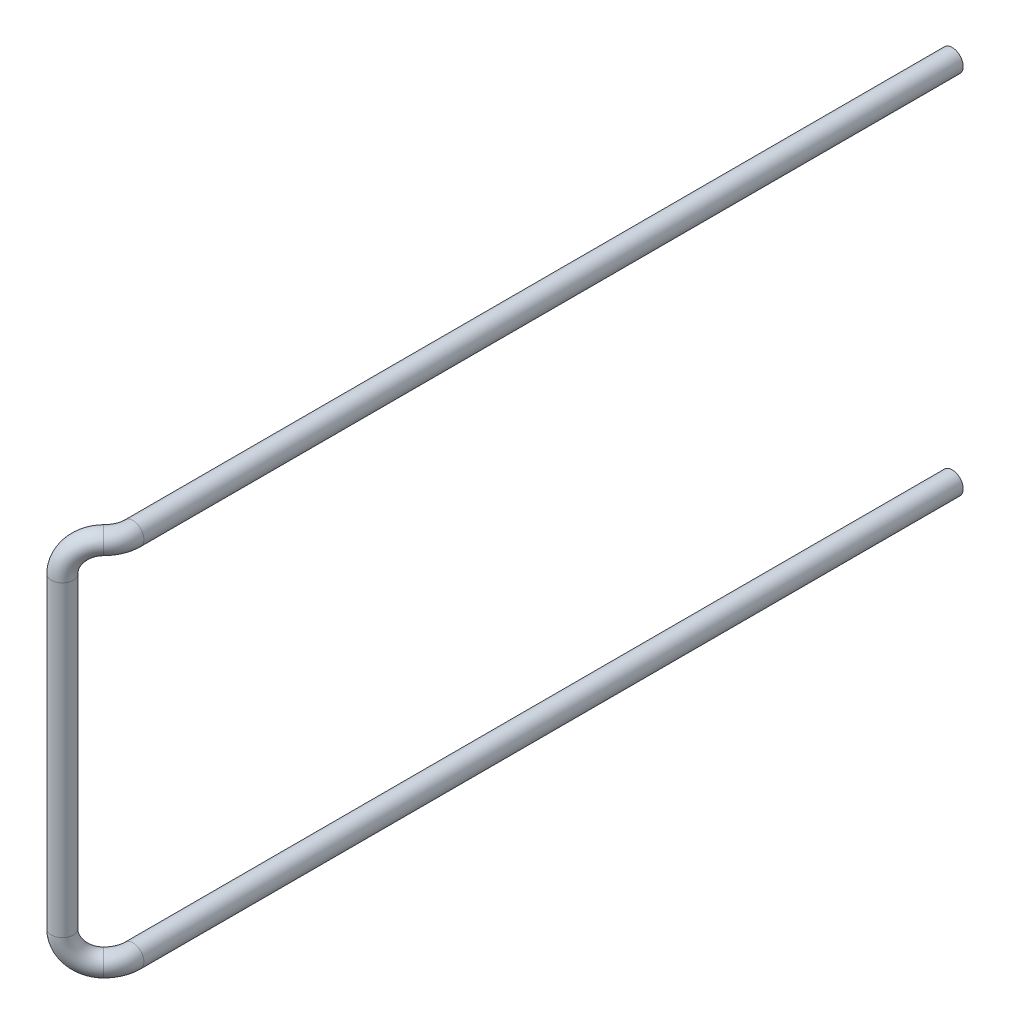
ISO-10303-21;
HEADER;
FILE_DESCRIPTION(('STEP AP214'),'2;1');
FILE_NAME('part.step','',(''),(''),'','','');
FILE_SCHEMA(('AUTOMOTIVE_DESIGN { 1 0 10303 214 1 1 1 1 }'));
ENDSEC;
DATA;
#1=APPLICATION_CONTEXT('core data for automotive mechanical design processes');
#2=APPLICATION_PROTOCOL_DEFINITION('international standard','automotive_design',2000,#1);
#3=PRODUCT_CONTEXT('',#1,'mechanical');
#4=PRODUCT('Part','Part','',(#3));
#5=PRODUCT_RELATED_PRODUCT_CATEGORY('part','',(#4));
#6=PRODUCT_DEFINITION_FORMATION('','',#4);
#7=PRODUCT_DEFINITION_CONTEXT('part definition',#1,'design');
#8=PRODUCT_DEFINITION('design','',#6,#7);
#9=PRODUCT_DEFINITION_SHAPE('','',#8);
#10=(LENGTH_UNIT() NAMED_UNIT(*) SI_UNIT(.MILLI.,.METRE.));
#11=(NAMED_UNIT(*) PLANE_ANGLE_UNIT() SI_UNIT($,.RADIAN.));
#12=(NAMED_UNIT(*) SI_UNIT($,.STERADIAN.) SOLID_ANGLE_UNIT());
#13=UNCERTAINTY_MEASURE_WITH_UNIT(LENGTH_MEASURE(1.E-05),#10,'distance_accuracy_value','');
#14=(GEOMETRIC_REPRESENTATION_CONTEXT(3) GLOBAL_UNCERTAINTY_ASSIGNED_CONTEXT((#13)) GLOBAL_UNIT_ASSIGNED_CONTEXT((#10,
#11,#12)) REPRESENTATION_CONTEXT('',''));
#15=CARTESIAN_POINT('',(0.,0.,0.));
#16=DIRECTION('',(0.,0.,1.));
#17=DIRECTION('',(1.,0.,0.));
#18=AXIS2_PLACEMENT_3D('',#15,#16,#17);
#19=CARTESIAN_POINT('',(0.,0.,355.6));
#20=DIRECTION('',(0.,0.,-1.));
#21=DIRECTION('',(-1.,0.,0.));
#22=AXIS2_PLACEMENT_3D('',#19,#20,#21);
#23=CYLINDRICAL_SURFACE('',#22,4.7625);
#24=CARTESIAN_POINT('',(0.,0.,355.6));
#25=DIRECTION('',(0.,0.,1.));
#26=DIRECTION('',(1.,0.,0.));
#27=AXIS2_PLACEMENT_3D('',#24,#25,#26);
#28=CIRCLE('',#27,4.7625);
#29=CARTESIAN_POINT('',(4.7625,0.,355.6));
#30=VERTEX_POINT('',#29);
#31=EDGE_CURVE('E11',#30,#30,#28,.T.);
#32=ORIENTED_EDGE('',*,*,#31,.F.);
#33=EDGE_LOOP('',(#32));
#34=FACE_BOUND('',#33,.T.);
#35=CARTESIAN_POINT('',(0.,0.,0.));
#36=DIRECTION('',(0.,0.,1.));
#37=DIRECTION('',(1.,0.,0.));
#38=AXIS2_PLACEMENT_3D('',#35,#36,#37);
#39=CIRCLE('',#38,4.7625);
#40=CARTESIAN_POINT('',(4.7625,0.,0.));
#41=VERTEX_POINT('',#40);
#42=EDGE_CURVE('E49',#41,#41,#39,.T.);
#43=ORIENTED_EDGE('',*,*,#42,.T.);
#44=EDGE_LOOP('',(#43));
#45=FACE_BOUND('',#44,.T.);
#46=ADVANCED_FACE('F50',(#34,#45),#23,.T.);
#47=CARTESIAN_POINT('',(0.,0.,0.));
#48=DIRECTION('',(0.,0.,1.));
#49=DIRECTION('',(1.,0.,0.));
#50=AXIS2_PLACEMENT_3D('',#47,#48,#49);
#51=PLANE('',#50);
#52=ORIENTED_EDGE('',*,*,#42,.F.);
#53=EDGE_LOOP('',(#52));
#54=FACE_BOUND('',#53,.T.);
#55=ADVANCED_FACE('F98',(#54),#51,.F.);
#56=CARTESIAN_POINT('',(-12.7,0.,355.6));
#57=DIRECTION('',(0.,-1.,0.));
#58=DIRECTION('',(0.,0.,-1.));
#59=AXIS2_PLACEMENT_3D('',#56,#57,#58);
#60=TOROIDAL_SURFACE('',#59,12.7,4.7625);
#61=CARTESIAN_POINT('',(-3.71974387893081,0.,364.580256121069));
#62=DIRECTION('',(-0.707106781186548,0.,0.707106781186547));
#63=DIRECTION('',(0.707106781186547,0.,0.707106781186548));
#64=AXIS2_PLACEMENT_3D('',#61,#62,#63);
#65=CIRCLE('',#64,4.7625);
#66=CARTESIAN_POINT('',(-0.352147833529869,0.,367.94785216647));
#67=VERTEX_POINT('',#66);
#68=EDGE_CURVE('E60',#67,#67,#65,.T.);
#69=CARTESIAN_POINT('',(-12.7,0.,355.6));
#70=DIRECTION('',(0.,-1.,0.));
#71=DIRECTION('',(0.,0.,-1.));
#72=AXIS2_PLACEMENT_3D('',#69,#70,#71);
#73=CIRCLE('',#72,17.4625);
#74=EDGE_CURVE('',#30,#67,#73,.T.);
#75=ORIENTED_EDGE('',*,*,#31,.T.);
#76=ORIENTED_EDGE('',*,*,#68,.F.);
#77=ORIENTED_EDGE('',*,*,#74,.T.);
#78=ORIENTED_EDGE('',*,*,#74,.F.);
#79=EDGE_LOOP('',(#75,#77,#76,#78));
#80=FACE_BOUND('',#79,.T.);
#81=ADVANCED_FACE('F94',(#80),#60,.T.);
#82=CARTESIAN_POINT('',(-3.71974387893083,-12.7,364.580256121069));
#83=DIRECTION('',(0.707106781186547,0.,0.707106781186548));
#84=DIRECTION('',(0.707106781186548,0.,-0.707106781186547));
#85=AXIS2_PLACEMENT_3D('',#82,#83,#84);
#86=TOROIDAL_SURFACE('',#85,12.7,4.7625);
#87=CARTESIAN_POINT('',(-12.7,-12.7,373.560512242138));
#88=DIRECTION('',(0.,-1.,0.));
#89=DIRECTION('',(0.707106781186547,0.,0.707106781186548));
#90=AXIS2_PLACEMENT_3D('',#87,#88,#89);
#91=CIRCLE('',#90,4.7625);
#92=CARTESIAN_POINT('',(-9.33240395459903,-12.7,376.928108287539));
#93=VERTEX_POINT('',#92);
#94=EDGE_CURVE('E62',#93,#93,#91,.T.);
#95=ORIENTED_EDGE('',*,*,#94,.F.);
#96=EDGE_LOOP('',(#95));
#97=FACE_BOUND('',#96,.T.);
#98=ORIENTED_EDGE('',*,*,#68,.T.);
#99=EDGE_LOOP('',(#98));
#100=FACE_BOUND('',#99,.T.);
#101=ADVANCED_FACE('F85',(#97,#100),#86,.T.);
#102=CARTESIAN_POINT('',(-12.6999999999998,-79.3750000000001,373.560512242138));
#103=DIRECTION('',(0.,1.,0.));
#104=DIRECTION('',(0.,0.,1.));
#105=AXIS2_PLACEMENT_3D('',#102,#103,#104);
#106=CYLINDRICAL_SURFACE('',#105,4.76249999999999);
#107=ORIENTED_EDGE('',*,*,#94,.T.);
#108=EDGE_LOOP('',(#107));
#109=FACE_BOUND('',#108,.T.);
#110=CARTESIAN_POINT('',(-12.6999999999997,-146.05,373.560512242138));
#111=DIRECTION('',(0.,-1.,0.));
#112=DIRECTION('',(0.707106781186547,0.,0.707106781186548));
#113=AXIS2_PLACEMENT_3D('',#110,#111,#112);
#114=CIRCLE('',#113,4.7625);
#115=CARTESIAN_POINT('',(-9.33240395459874,-146.05,376.928108287539));
#116=VERTEX_POINT('',#115);
#117=EDGE_CURVE('E71',#116,#116,#114,.T.);
#118=ORIENTED_EDGE('',*,*,#117,.F.);
#119=EDGE_LOOP('',(#118));
#120=FACE_BOUND('',#119,.T.);
#121=ADVANCED_FACE('F78',(#109,#120),#106,.T.);
#122=CARTESIAN_POINT('',(3.43683415060525E-13,-158.75,355.6));
#123=DIRECTION('',(0.,0.,-1.));
#124=DIRECTION('',(-1.,0.,0.));
#125=AXIS2_PLACEMENT_3D('',#122,#123,#124);
#126=CYLINDRICAL_SURFACE('',#125,4.7625);
#127=CARTESIAN_POINT('',(3.43683415060525E-13,-158.75,355.6));
#128=DIRECTION('',(0.,0.,-1.));
#129=DIRECTION('',(1.,0.,0.));
#130=AXIS2_PLACEMENT_3D('',#127,#128,#129);
#131=CIRCLE('',#130,4.7625);
#132=CARTESIAN_POINT('',(4.76250000000034,-158.75,355.6));
#133=VERTEX_POINT('',#132);
#134=EDGE_CURVE('E61',#133,#133,#131,.T.);
#135=ORIENTED_EDGE('',*,*,#134,.T.);
#136=EDGE_LOOP('',(#135));
#137=FACE_BOUND('',#136,.T.);
#138=CARTESIAN_POINT('',(3.43683415060522E-13,-158.749999999998,-3.61308205576446E-13));
#139=DIRECTION('',(0.,0.,-1.));
#140=DIRECTION('',(1.,0.,0.));
#141=AXIS2_PLACEMENT_3D('',#138,#139,#140);
#142=CIRCLE('',#141,4.7625);
#143=CARTESIAN_POINT('',(4.76250000000034,-158.749999999998,-3.61308205576446E-13));
#144=VERTEX_POINT('',#143);
#145=EDGE_CURVE('E63',#144,#144,#142,.T.);
#146=ORIENTED_EDGE('',*,*,#145,.F.);
#147=EDGE_LOOP('',(#146));
#148=FACE_BOUND('',#147,.T.);
#149=ADVANCED_FACE('F84',(#137,#148),#126,.T.);
#150=CARTESIAN_POINT('',(3.43683415060522E-13,-158.749999999998,-3.61308205576446E-13));
#151=DIRECTION('',(0.,0.,1.));
#152=DIRECTION('',(1.,0.,0.));
#153=AXIS2_PLACEMENT_3D('',#150,#151,#152);
#154=PLANE('',#153);
#155=ORIENTED_EDGE('',*,*,#145,.T.);
#156=EDGE_LOOP('',(#155));
#157=FACE_BOUND('',#156,.T.);
#158=ADVANCED_FACE('F89',(#157),#154,.F.);
#159=CARTESIAN_POINT('',(-12.6999999999997,-158.75,355.6));
#160=DIRECTION('',(0.,1.,0.));
#161=DIRECTION('',(0.,0.,-1.));
#162=AXIS2_PLACEMENT_3D('',#159,#160,#161);
#163=TOROIDAL_SURFACE('',#162,12.7,4.7625);
#164=CARTESIAN_POINT('',(-3.71974387893047,-158.75,364.580256121069));
#165=DIRECTION('',(0.707106781186548,0.,-0.707106781186547));
#166=DIRECTION('',(0.707106781186547,0.,0.707106781186548));
#167=AXIS2_PLACEMENT_3D('',#164,#165,#166);
#168=CIRCLE('',#167,4.7625);
#169=CARTESIAN_POINT('',(-0.352147833529526,-158.75,367.94785216647));
#170=VERTEX_POINT('',#169);
#171=EDGE_CURVE('E70',#170,#170,#168,.T.);
#172=CARTESIAN_POINT('',(-12.6999999999997,-158.75,355.6));
#173=DIRECTION('',(0.,1.,0.));
#174=DIRECTION('',(0.,0.,-1.));
#175=AXIS2_PLACEMENT_3D('',#172,#173,#174);
#176=CIRCLE('',#175,17.4625);
#177=EDGE_CURVE('',#170,#133,#176,.T.);
#178=ORIENTED_EDGE('',*,*,#171,.T.);
#179=ORIENTED_EDGE('',*,*,#134,.F.);
#180=ORIENTED_EDGE('',*,*,#177,.T.);
#181=ORIENTED_EDGE('',*,*,#177,.F.);
#182=EDGE_LOOP('',(#178,#180,#179,#181));
#183=FACE_BOUND('',#182,.T.);
#184=ADVANCED_FACE('F145',(#183),#163,.T.);
#185=CARTESIAN_POINT('',(-3.71974387893054,-146.05,364.580256121069));
#186=DIRECTION('',(0.707106781186547,0.,0.707106781186548));
#187=DIRECTION('',(0.707106781186548,0.,-0.707106781186547));
#188=AXIS2_PLACEMENT_3D('',#185,#186,#187);
#189=TOROIDAL_SURFACE('',#188,12.7,4.7625);
#190=ORIENTED_EDGE('',*,*,#117,.T.);
#191=EDGE_LOOP('',(#190));
#192=FACE_BOUND('',#191,.T.);
#193=ORIENTED_EDGE('',*,*,#171,.F.);
#194=EDGE_LOOP('',(#193));
#195=FACE_BOUND('',#194,.T.);
#196=ADVANCED_FACE('F79',(#192,#195),#189,.T.);
#197=CLOSED_SHELL('',(#46,#55,#81,#101,#121,#149,#158,#184,#196));
#198=MANIFOLD_SOLID_BREP('B2',#197);
#199=ADVANCED_BREP_SHAPE_REPRESENTATION('',(#18,#198),#14);
#200=SHAPE_DEFINITION_REPRESENTATION(#9,#199);
ENDSEC;
END-ISO-10303-21;
